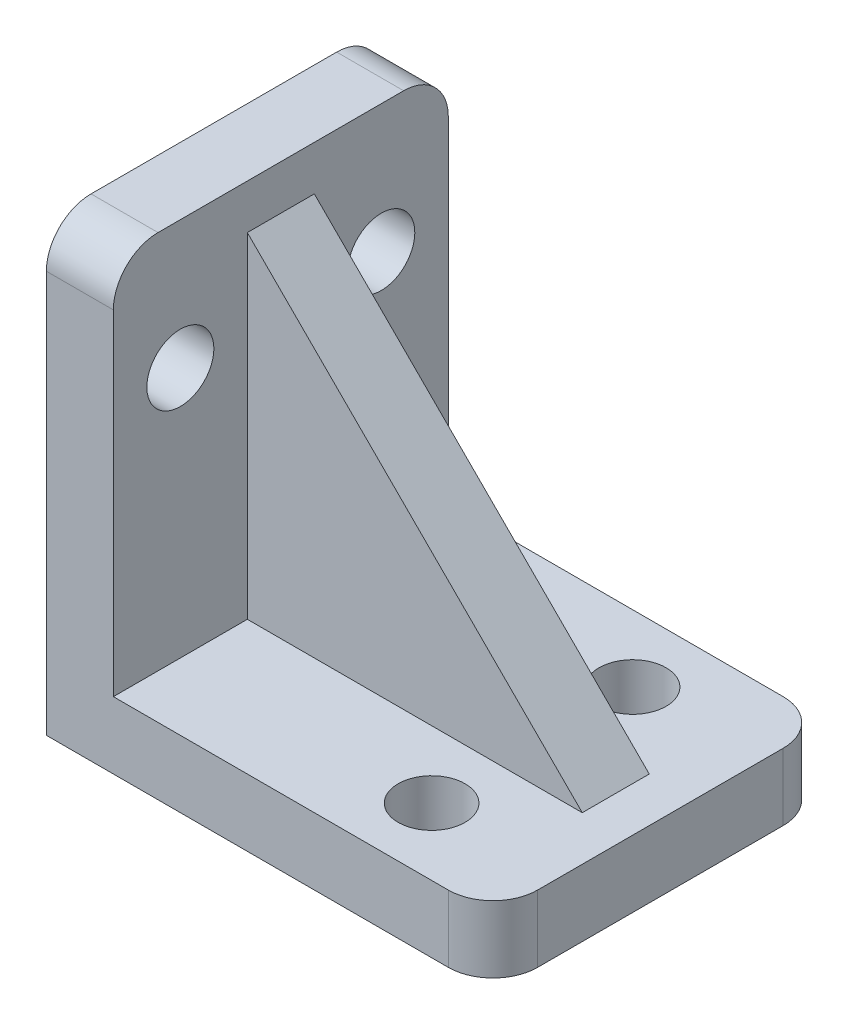
ISO-10303-21;
HEADER;
FILE_DESCRIPTION(('STEP AP214'),'2;1');
FILE_NAME('part.step','',(''),(''),'','','');
FILE_SCHEMA(('AUTOMOTIVE_DESIGN { 1 0 10303 214 1 1 1 1 }'));
ENDSEC;
DATA;
#1=APPLICATION_CONTEXT('core data for automotive mechanical design processes');
#2=APPLICATION_PROTOCOL_DEFINITION('international standard','automotive_design',2000,#1);
#3=PRODUCT_CONTEXT('',#1,'mechanical');
#4=PRODUCT('Part','Part','',(#3));
#5=PRODUCT_RELATED_PRODUCT_CATEGORY('part','',(#4));
#6=PRODUCT_DEFINITION_FORMATION('','',#4);
#7=PRODUCT_DEFINITION_CONTEXT('part definition',#1,'design');
#8=PRODUCT_DEFINITION('design','',#6,#7);
#9=PRODUCT_DEFINITION_SHAPE('','',#8);
#10=(LENGTH_UNIT() NAMED_UNIT(*) SI_UNIT(.MILLI.,.METRE.));
#11=(NAMED_UNIT(*) PLANE_ANGLE_UNIT() SI_UNIT($,.RADIAN.));
#12=(NAMED_UNIT(*) SI_UNIT($,.STERADIAN.) SOLID_ANGLE_UNIT());
#13=UNCERTAINTY_MEASURE_WITH_UNIT(LENGTH_MEASURE(1.E-05),#10,'distance_accuracy_value','');
#14=(GEOMETRIC_REPRESENTATION_CONTEXT(3) GLOBAL_UNCERTAINTY_ASSIGNED_CONTEXT((#13)) GLOBAL_UNIT_ASSIGNED_CONTEXT((#10,
#11,#12)) REPRESENTATION_CONTEXT('',''));
#15=CARTESIAN_POINT('',(0.,0.,0.));
#16=DIRECTION('',(0.,0.,1.));
#17=DIRECTION('',(1.,0.,0.));
#18=AXIS2_PLACEMENT_3D('',#15,#16,#17);
#19=CARTESIAN_POINT('',(-4.63485477178423,10.3236514522822,6.));
#20=DIRECTION('',(-0.707106781186547,-0.707106781186548,0.));
#21=DIRECTION('',(0.707106781186548,-0.707106781186547,0.));
#22=AXIS2_PLACEMENT_3D('',#19,#20,#21);
#23=PLANE('',#22);
#24=DIRECTION('',(0.707106781186548,-0.707106781186547,0.));
#25=VECTOR('',#24,1.);
#26=CARTESIAN_POINT('',(-4.63485477178423,10.3236514522822,9.));
#27=LINE('',#26,#25);
#28=CARTESIAN_POINT('',(-4.63485477178423,10.3236514522822,9.));
#29=VERTEX_POINT('',#28);
#30=CARTESIAN_POINT('',(10.3651452282158,-4.67634854771784,9.));
#31=VERTEX_POINT('',#30);
#32=EDGE_CURVE('E97',#29,#31,#27,.T.);
#33=ORIENTED_EDGE('',*,*,#32,.T.);
#34=DIRECTION('',(0.,0.,1.));
#35=VECTOR('',#34,1.);
#36=CARTESIAN_POINT('',(10.3651452282158,-4.67634854771784,6.));
#37=LINE('',#36,#35);
#38=CARTESIAN_POINT('',(10.3651452282158,-4.67634854771784,6.));
#39=VERTEX_POINT('',#38);
#40=EDGE_CURVE('E12',#39,#31,#37,.T.);
#41=ORIENTED_EDGE('',*,*,#40,.F.);
#42=DIRECTION('',(0.707106781186548,-0.707106781186547,0.));
#43=VECTOR('',#42,1.);
#44=CARTESIAN_POINT('',(-4.63485477178423,10.3236514522822,6.));
#45=LINE('',#44,#43);
#46=CARTESIAN_POINT('',(-4.63485477178423,10.3236514522822,6.));
#47=VERTEX_POINT('',#46);
#48=EDGE_CURVE('E90',#47,#39,#45,.T.);
#49=ORIENTED_EDGE('',*,*,#48,.F.);
#50=DIRECTION('',(0.,0.,1.));
#51=VECTOR('',#50,1.);
#52=CARTESIAN_POINT('',(-4.63485477178423,10.3236514522822,6.));
#53=LINE('',#52,#51);
#54=EDGE_CURVE('E98',#47,#29,#53,.T.);
#55=ORIENTED_EDGE('',*,*,#54,.T.);
#56=EDGE_LOOP('',(#33,#41,#49,#55));
#57=FACE_BOUND('',#56,.T.);
#58=ADVANCED_FACE('F50',(#57),#23,.F.);
#59=CARTESIAN_POINT('',(-4.63485477178423,-4.67634854771784,6.));
#60=DIRECTION('',(0.,1.,0.));
#61=DIRECTION('',(-1.,0.,0.));
#62=AXIS2_PLACEMENT_3D('',#59,#60,#61);
#63=PLANE('',#62);
#64=DIRECTION('',(-1.,0.,0.));
#65=VECTOR('',#64,1.);
#66=CARTESIAN_POINT('',(-4.63485477178423,-4.67634854771784,9.));
#67=LINE('',#66,#65);
#68=CARTESIAN_POINT('',(-4.63485477178423,-4.67634854771784,9.));
#69=VERTEX_POINT('',#68);
#70=EDGE_CURVE('E78',#31,#69,#67,.T.);
#71=ORIENTED_EDGE('',*,*,#70,.T.);
#72=DIRECTION('',(0.,0.,1.));
#73=VECTOR('',#72,1.);
#74=CARTESIAN_POINT('',(-4.63485477178423,-4.67634854771784,6.));
#75=LINE('',#74,#73);
#76=CARTESIAN_POINT('',(-4.63485477178423,-4.67634854771784,6.));
#77=VERTEX_POINT('',#76);
#78=EDGE_CURVE('E58',#77,#69,#75,.T.);
#79=ORIENTED_EDGE('',*,*,#78,.F.);
#80=DIRECTION('',(-1.,0.,0.));
#81=VECTOR('',#80,1.);
#82=CARTESIAN_POINT('',(-4.63485477178423,-4.67634854771784,6.));
#83=LINE('',#82,#81);
#84=EDGE_CURVE('E86',#39,#77,#83,.T.);
#85=ORIENTED_EDGE('',*,*,#84,.F.);
#86=ORIENTED_EDGE('',*,*,#40,.T.);
#87=EDGE_LOOP('',(#71,#79,#85,#86));
#88=FACE_BOUND('',#87,.T.);
#89=ADVANCED_FACE('F87',(#88),#63,.F.);
#90=CARTESIAN_POINT('',(-4.63485477178423,-4.67634854771784,6.));
#91=DIRECTION('',(1.,0.,0.));
#92=DIRECTION('',(0.,1.,0.));
#93=AXIS2_PLACEMENT_3D('',#90,#91,#92);
#94=PLANE('',#93);
#95=DIRECTION('',(0.,1.,0.));
#96=VECTOR('',#95,1.);
#97=CARTESIAN_POINT('',(-4.63485477178423,-4.67634854771784,9.));
#98=LINE('',#97,#96);
#99=EDGE_CURVE('E83',#69,#29,#98,.T.);
#100=ORIENTED_EDGE('',*,*,#99,.T.);
#101=ORIENTED_EDGE('',*,*,#54,.F.);
#102=DIRECTION('',(0.,1.,0.));
#103=VECTOR('',#102,1.);
#104=CARTESIAN_POINT('',(-4.63485477178423,-4.67634854771784,6.));
#105=LINE('',#104,#103);
#106=EDGE_CURVE('E66',#77,#47,#105,.T.);
#107=ORIENTED_EDGE('',*,*,#106,.F.);
#108=ORIENTED_EDGE('',*,*,#78,.T.);
#109=EDGE_LOOP('',(#100,#101,#107,#108));
#110=FACE_BOUND('',#109,.T.);
#111=ADVANCED_FACE('F105',(#110),#94,.F.);
#112=CARTESIAN_POINT('',(0.,0.,6.));
#113=DIRECTION('',(0.,0.,1.));
#114=DIRECTION('',(1.,0.,0.));
#115=AXIS2_PLACEMENT_3D('',#112,#113,#114);
#116=PLANE('',#115);
#117=ORIENTED_EDGE('',*,*,#48,.T.);
#118=ORIENTED_EDGE('',*,*,#84,.T.);
#119=ORIENTED_EDGE('',*,*,#106,.T.);
#120=EDGE_LOOP('',(#117,#118,#119));
#121=FACE_BOUND('',#120,.T.);
#122=ADVANCED_FACE('F93',(#121),#116,.F.);
#123=CARTESIAN_POINT('',(0.,0.,9.));
#124=DIRECTION('',(0.,0.,1.));
#125=DIRECTION('',(1.,0.,0.));
#126=AXIS2_PLACEMENT_3D('',#123,#124,#125);
#127=PLANE('',#126);
#128=ORIENTED_EDGE('',*,*,#32,.F.);
#129=ORIENTED_EDGE('',*,*,#99,.F.);
#130=ORIENTED_EDGE('',*,*,#70,.F.);
#131=EDGE_LOOP('',(#128,#129,#130));
#132=FACE_BOUND('',#131,.T.);
#133=ADVANCED_FACE('F106',(#132),#127,.T.);
#134=CLOSED_SHELL('',(#58,#89,#111,#122,#133));
#135=MANIFOLD_SOLID_BREP('B2',#134);
#136=CARTESIAN_POINT('',(-7.63485477178423,-7.67634854771784,15.));
#137=DIRECTION('',(0.,1.,0.));
#138=DIRECTION('',(0.,0.,1.));
#139=AXIS2_PLACEMENT_3D('',#136,#137,#138);
#140=PLANE('',#139);
#141=DIRECTION('',(1.,0.,0.));
#142=VECTOR('',#141,1.);
#143=CARTESIAN_POINT('',(-7.63485477178423,-7.67634854771784,0.));
#144=LINE('',#143,#142);
#145=CARTESIAN_POINT('',(-7.63485477178423,-7.67634854771784,0.));
#146=VERTEX_POINT('',#145);
#147=CARTESIAN_POINT('',(10.3651452282158,-7.67634854771784,0.));
#148=VERTEX_POINT('',#147);
#149=EDGE_CURVE('E273',#146,#148,#144,.T.);
#150=ORIENTED_EDGE('',*,*,#149,.T.);
#151=CARTESIAN_POINT('',(10.3651452282158,-7.67634854771784,2.));
#152=DIRECTION('',(0.,1.,0.));
#153=DIRECTION('',(0.,0.,1.));
#154=AXIS2_PLACEMENT_3D('',#151,#152,#153);
#155=CIRCLE('',#154,2.);
#156=CARTESIAN_POINT('',(12.3651452282158,-7.67634854771784,2.));
#157=VERTEX_POINT('',#156);
#158=EDGE_CURVE('E319',#148,#157,#155,.F.);
#159=ORIENTED_EDGE('',*,*,#158,.T.);
#160=DIRECTION('',(0.,0.,-1.));
#161=VECTOR('',#160,1.);
#162=CARTESIAN_POINT('',(12.3651452282158,-7.67634854771784,15.));
#163=LINE('',#162,#161);
#164=CARTESIAN_POINT('',(12.3651452282158,-7.67634854771784,13.));
#165=VERTEX_POINT('',#164);
#166=EDGE_CURVE('E254',#165,#157,#163,.T.);
#167=ORIENTED_EDGE('',*,*,#166,.F.);
#168=CARTESIAN_POINT('',(10.3651452282158,-7.67634854771784,13.));
#169=DIRECTION('',(0.,1.,0.));
#170=DIRECTION('',(0.,0.,1.));
#171=AXIS2_PLACEMENT_3D('',#168,#169,#170);
#172=CIRCLE('',#171,2.);
#173=CARTESIAN_POINT('',(10.3651452282158,-7.67634854771784,15.));
#174=VERTEX_POINT('',#173);
#175=EDGE_CURVE('E259',#165,#174,#172,.F.);
#176=ORIENTED_EDGE('',*,*,#175,.T.);
#177=DIRECTION('',(1.,0.,0.));
#178=VECTOR('',#177,1.);
#179=CARTESIAN_POINT('',(-7.63485477178423,-7.67634854771784,15.));
#180=LINE('',#179,#178);
#181=CARTESIAN_POINT('',(-7.63485477178423,-7.67634854771784,15.));
#182=VERTEX_POINT('',#181);
#183=EDGE_CURVE('E234',#182,#174,#180,.T.);
#184=ORIENTED_EDGE('',*,*,#183,.F.);
#185=DIRECTION('',(0.,0.,-1.));
#186=VECTOR('',#185,1.);
#187=CARTESIAN_POINT('',(-7.63485477178423,-7.67634854771784,15.));
#188=LINE('',#187,#186);
#189=EDGE_CURVE('E244',#182,#146,#188,.T.);
#190=ORIENTED_EDGE('',*,*,#189,.T.);
#191=EDGE_LOOP('',(#150,#159,#167,#176,#184,#190));
#192=FACE_BOUND('',#191,.T.);
#193=CARTESIAN_POINT('',(6.61809640509843,-7.67634854771784,12.));
#194=DIRECTION('',(0.,1.,0.));
#195=DIRECTION('',(0.,0.,1.));
#196=AXIS2_PLACEMENT_3D('',#193,#194,#195);
#197=CIRCLE('',#196,1.5);
#198=CARTESIAN_POINT('',(6.61809640509843,-7.67634854771784,13.5));
#199=VERTEX_POINT('',#198);
#200=EDGE_CURVE('E525',#199,#199,#197,.F.);
#201=ORIENTED_EDGE('',*,*,#200,.F.);
#202=EDGE_LOOP('',(#201));
#203=FACE_BOUND('',#202,.T.);
#204=CARTESIAN_POINT('',(6.61809640509846,-7.67634854771784,3.00000000000004));
#205=DIRECTION('',(0.,1.,0.));
#206=DIRECTION('',(0.,0.,1.));
#207=AXIS2_PLACEMENT_3D('',#204,#205,#206);
#208=CIRCLE('',#207,1.5);
#209=CARTESIAN_POINT('',(6.61809640509846,-7.67634854771784,4.50000000000004));
#210=VERTEX_POINT('',#209);
#211=EDGE_CURVE('E520',#210,#210,#208,.T.);
#212=ORIENTED_EDGE('',*,*,#211,.T.);
#213=EDGE_LOOP('',(#212));
#214=FACE_BOUND('',#213,.T.);
#215=ADVANCED_FACE('F150',(#192,#203,#214),#140,.F.);
#216=CARTESIAN_POINT('',(12.3651452282158,-4.67634854771784,15.));
#217=DIRECTION('',(0.,-1.,0.));
#218=DIRECTION('',(1.,0.,0.));
#219=AXIS2_PLACEMENT_3D('',#216,#217,#218);
#220=PLANE('',#219);
#221=DIRECTION('',(0.,0.,-1.));
#222=VECTOR('',#221,1.);
#223=CARTESIAN_POINT('',(12.3651452282158,-4.67634854771784,15.));
#224=LINE('',#223,#222);
#225=CARTESIAN_POINT('',(12.3651452282158,-4.67634854771784,13.));
#226=VERTEX_POINT('',#225);
#227=CARTESIAN_POINT('',(12.3651452282158,-4.67634854771784,2.));
#228=VERTEX_POINT('',#227);
#229=EDGE_CURVE('E288',#226,#228,#224,.T.);
#230=ORIENTED_EDGE('',*,*,#229,.T.);
#231=CARTESIAN_POINT('',(10.3651452282158,-4.67634854771784,2.));
#232=DIRECTION('',(0.,-1.,0.));
#233=DIRECTION('',(1.,0.,0.));
#234=AXIS2_PLACEMENT_3D('',#231,#232,#233);
#235=CIRCLE('',#234,2.);
#236=CARTESIAN_POINT('',(10.3651452282158,-4.67634854771784,0.));
#237=VERTEX_POINT('',#236);
#238=EDGE_CURVE('E308',#228,#237,#235,.F.);
#239=ORIENTED_EDGE('',*,*,#238,.T.);
#240=DIRECTION('',(-1.,0.,0.));
#241=VECTOR('',#240,1.);
#242=CARTESIAN_POINT('',(12.3651452282158,-4.67634854771784,0.));
#243=LINE('',#242,#241);
#244=CARTESIAN_POINT('',(-4.63485477178423,-4.67634854771784,0.));
#245=VERTEX_POINT('',#244);
#246=EDGE_CURVE('E277',#237,#245,#243,.T.);
#247=ORIENTED_EDGE('',*,*,#246,.T.);
#248=DIRECTION('',(0.,0.,-1.));
#249=VECTOR('',#248,1.);
#250=CARTESIAN_POINT('',(-4.63485477178423,-4.67634854771784,15.));
#251=LINE('',#250,#249);
#252=CARTESIAN_POINT('',(-4.63485477178423,-4.67634854771784,15.));
#253=VERTEX_POINT('',#252);
#254=EDGE_CURVE('E284',#253,#245,#251,.T.);
#255=ORIENTED_EDGE('',*,*,#254,.F.);
#256=DIRECTION('',(-1.,0.,0.));
#257=VECTOR('',#256,1.);
#258=CARTESIAN_POINT('',(12.3651452282158,-4.67634854771784,15.));
#259=LINE('',#258,#257);
#260=CARTESIAN_POINT('',(10.3651452282158,-4.67634854771784,15.));
#261=VERTEX_POINT('',#260);
#262=EDGE_CURVE('E261',#261,#253,#259,.T.);
#263=ORIENTED_EDGE('',*,*,#262,.F.);
#264=CARTESIAN_POINT('',(10.3651452282158,-4.67634854771784,13.));
#265=DIRECTION('',(0.,-1.,0.));
#266=DIRECTION('',(1.,0.,0.));
#267=AXIS2_PLACEMENT_3D('',#264,#265,#266);
#268=CIRCLE('',#267,2.);
#269=EDGE_CURVE('E305',#261,#226,#268,.F.);
#270=ORIENTED_EDGE('',*,*,#269,.T.);
#271=EDGE_LOOP('',(#230,#239,#247,#255,#263,#270));
#272=FACE_BOUND('',#271,.T.);
#273=CARTESIAN_POINT('',(6.61809640509843,-4.67634854771784,12.));
#274=DIRECTION('',(0.,1.,0.));
#275=DIRECTION('',(-1.,0.,0.));
#276=AXIS2_PLACEMENT_3D('',#273,#274,#275);
#277=CIRCLE('',#276,1.5);
#278=CARTESIAN_POINT('',(5.11809640509843,-4.67634854771784,12.));
#279=VERTEX_POINT('',#278);
#280=EDGE_CURVE('E530',#279,#279,#277,.F.);
#281=ORIENTED_EDGE('',*,*,#280,.T.);
#282=EDGE_LOOP('',(#281));
#283=FACE_BOUND('',#282,.T.);
#284=CARTESIAN_POINT('',(6.61809640509846,-4.67634854771784,3.00000000000004));
#285=DIRECTION('',(0.,1.,0.));
#286=DIRECTION('',(-1.,0.,0.));
#287=AXIS2_PLACEMENT_3D('',#284,#285,#286);
#288=CIRCLE('',#287,1.5);
#289=CARTESIAN_POINT('',(5.11809640509846,-4.67634854771784,3.00000000000004));
#290=VERTEX_POINT('',#289);
#291=EDGE_CURVE('E529',#290,#290,#288,.T.);
#292=ORIENTED_EDGE('',*,*,#291,.F.);
#293=EDGE_LOOP('',(#292));
#294=FACE_BOUND('',#293,.T.);
#295=ADVANCED_FACE('F351',(#272,#283,#294),#220,.F.);
#296=CARTESIAN_POINT('',(-7.63485477178423,12.3236514522822,15.));
#297=DIRECTION('',(1.,0.,0.));
#298=DIRECTION('',(0.,0.,-1.));
#299=AXIS2_PLACEMENT_3D('',#296,#297,#298);
#300=PLANE('',#299);
#301=DIRECTION('',(0.,-1.,0.));
#302=VECTOR('',#301,1.);
#303=CARTESIAN_POINT('',(-7.63485477178423,12.3236514522822,15.));
#304=LINE('',#303,#302);
#305=CARTESIAN_POINT('',(-7.63485477178423,10.3236514522822,15.));
#306=VERTEX_POINT('',#305);
#307=EDGE_CURVE('E229',#306,#182,#304,.T.);
#308=ORIENTED_EDGE('',*,*,#307,.F.);
#309=CARTESIAN_POINT('',(-7.63485477178423,10.3236514522822,13.));
#310=DIRECTION('',(1.,0.,0.));
#311=DIRECTION('',(0.,0.,-1.));
#312=AXIS2_PLACEMENT_3D('',#309,#310,#311);
#313=CIRCLE('',#312,2.);
#314=CARTESIAN_POINT('',(-7.63485477178423,12.3236514522822,13.));
#315=VERTEX_POINT('',#314);
#316=EDGE_CURVE('E330',#306,#315,#313,.F.);
#317=ORIENTED_EDGE('',*,*,#316,.T.);
#318=DIRECTION('',(0.,0.,-1.));
#319=VECTOR('',#318,1.);
#320=CARTESIAN_POINT('',(-7.63485477178423,12.3236514522822,15.));
#321=LINE('',#320,#319);
#322=CARTESIAN_POINT('',(-7.63485477178423,12.3236514522822,2.));
#323=VERTEX_POINT('',#322);
#324=EDGE_CURVE('E253',#315,#323,#321,.T.);
#325=ORIENTED_EDGE('',*,*,#324,.T.);
#326=CARTESIAN_POINT('',(-7.63485477178423,10.3236514522822,2.));
#327=DIRECTION('',(1.,0.,0.));
#328=DIRECTION('',(0.,0.,-1.));
#329=AXIS2_PLACEMENT_3D('',#326,#327,#328);
#330=CIRCLE('',#329,2.);
#331=CARTESIAN_POINT('',(-7.63485477178423,10.3236514522822,0.));
#332=VERTEX_POINT('',#331);
#333=EDGE_CURVE('E327',#323,#332,#330,.F.);
#334=ORIENTED_EDGE('',*,*,#333,.T.);
#335=DIRECTION('',(0.,-1.,0.));
#336=VECTOR('',#335,1.);
#337=CARTESIAN_POINT('',(-7.63485477178423,12.3236514522822,0.));
#338=LINE('',#337,#336);
#339=EDGE_CURVE('E248',#332,#146,#338,.T.);
#340=ORIENTED_EDGE('',*,*,#339,.T.);
#341=ORIENTED_EDGE('',*,*,#189,.F.);
#342=EDGE_LOOP('',(#308,#317,#325,#334,#340,#341));
#343=FACE_BOUND('',#342,.T.);
#344=CARTESIAN_POINT('',(-7.63485477178423,6.57660262916484,3.));
#345=DIRECTION('',(1.,0.,0.));
#346=DIRECTION('',(0.,0.,-1.));
#347=AXIS2_PLACEMENT_3D('',#344,#345,#346);
#348=CIRCLE('',#347,1.5);
#349=CARTESIAN_POINT('',(-7.63485477178423,6.57660262916484,1.5));
#350=VERTEX_POINT('',#349);
#351=EDGE_CURVE('E509',#350,#350,#348,.F.);
#352=ORIENTED_EDGE('',*,*,#351,.F.);
#353=EDGE_LOOP('',(#352));
#354=FACE_BOUND('',#353,.T.);
#355=CARTESIAN_POINT('',(-7.63485477178423,6.57660262916484,12.));
#356=DIRECTION('',(1.,0.,0.));
#357=DIRECTION('',(0.,0.,-1.));
#358=AXIS2_PLACEMENT_3D('',#355,#356,#357);
#359=CIRCLE('',#358,1.5);
#360=CARTESIAN_POINT('',(-7.63485477178423,6.57660262916484,10.5));
#361=VERTEX_POINT('',#360);
#362=EDGE_CURVE('E274',#361,#361,#359,.T.);
#363=ORIENTED_EDGE('',*,*,#362,.T.);
#364=EDGE_LOOP('',(#363));
#365=FACE_BOUND('',#364,.T.);
#366=ADVANCED_FACE('F245',(#343,#354,#365),#300,.F.);
#367=CARTESIAN_POINT('',(-4.63485477178423,-4.67634854771784,15.));
#368=DIRECTION('',(-1.,0.,0.));
#369=DIRECTION('',(0.,-1.,0.));
#370=AXIS2_PLACEMENT_3D('',#367,#368,#369);
#371=PLANE('',#370);
#372=DIRECTION('',(0.,0.,-1.));
#373=VECTOR('',#372,1.);
#374=CARTESIAN_POINT('',(-4.63485477178423,12.3236514522822,15.));
#375=LINE('',#374,#373);
#376=CARTESIAN_POINT('',(-4.63485477178423,12.3236514522822,13.));
#377=VERTEX_POINT('',#376);
#378=CARTESIAN_POINT('',(-4.63485477178423,12.3236514522822,2.));
#379=VERTEX_POINT('',#378);
#380=EDGE_CURVE('E270',#377,#379,#375,.T.);
#381=ORIENTED_EDGE('',*,*,#380,.F.);
#382=CARTESIAN_POINT('',(-4.63485477178423,10.3236514522822,13.));
#383=DIRECTION('',(-1.,0.,0.));
#384=DIRECTION('',(0.,-1.,0.));
#385=AXIS2_PLACEMENT_3D('',#382,#383,#384);
#386=CIRCLE('',#385,2.);
#387=CARTESIAN_POINT('',(-4.63485477178423,10.3236514522822,15.));
#388=VERTEX_POINT('',#387);
#389=EDGE_CURVE('E48',#377,#388,#386,.F.);
#390=ORIENTED_EDGE('',*,*,#389,.T.);
#391=DIRECTION('',(0.,1.,0.));
#392=VECTOR('',#391,1.);
#393=CARTESIAN_POINT('',(-4.63485477178423,-4.67634854771784,15.));
#394=LINE('',#393,#392);
#395=EDGE_CURVE('E264',#253,#388,#394,.T.);
#396=ORIENTED_EDGE('',*,*,#395,.F.);
#397=ORIENTED_EDGE('',*,*,#254,.T.);
#398=DIRECTION('',(0.,1.,0.));
#399=VECTOR('',#398,1.);
#400=CARTESIAN_POINT('',(-4.63485477178423,-4.67634854771784,0.));
#401=LINE('',#400,#399);
#402=CARTESIAN_POINT('',(-4.63485477178423,10.3236514522822,0.));
#403=VERTEX_POINT('',#402);
#404=EDGE_CURVE('E241',#245,#403,#401,.T.);
#405=ORIENTED_EDGE('',*,*,#404,.T.);
#406=CARTESIAN_POINT('',(-4.63485477178423,10.3236514522822,2.));
#407=DIRECTION('',(-1.,0.,0.));
#408=DIRECTION('',(0.,-1.,0.));
#409=AXIS2_PLACEMENT_3D('',#406,#407,#408);
#410=CIRCLE('',#409,2.);
#411=EDGE_CURVE('E159',#403,#379,#410,.F.);
#412=ORIENTED_EDGE('',*,*,#411,.T.);
#413=EDGE_LOOP('',(#381,#390,#396,#397,#405,#412));
#414=FACE_BOUND('',#413,.T.);
#415=CARTESIAN_POINT('',(-4.63485477178423,6.57660262916484,3.));
#416=DIRECTION('',(1.,0.,0.));
#417=DIRECTION('',(0.,1.,0.));
#418=AXIS2_PLACEMENT_3D('',#415,#416,#417);
#419=CIRCLE('',#418,1.5);
#420=CARTESIAN_POINT('',(-4.63485477178423,8.07660262916484,3.));
#421=VERTEX_POINT('',#420);
#422=EDGE_CURVE('E506',#421,#421,#419,.F.);
#423=ORIENTED_EDGE('',*,*,#422,.T.);
#424=EDGE_LOOP('',(#423));
#425=FACE_BOUND('',#424,.T.);
#426=CARTESIAN_POINT('',(-4.63485477178423,6.57660262916484,12.));
#427=DIRECTION('',(1.,0.,0.));
#428=DIRECTION('',(0.,1.,0.));
#429=AXIS2_PLACEMENT_3D('',#426,#427,#428);
#430=CIRCLE('',#429,1.5);
#431=CARTESIAN_POINT('',(-4.63485477178423,8.07660262916484,12.));
#432=VERTEX_POINT('',#431);
#433=EDGE_CURVE('E511',#432,#432,#430,.T.);
#434=ORIENTED_EDGE('',*,*,#433,.F.);
#435=EDGE_LOOP('',(#434));
#436=FACE_BOUND('',#435,.T.);
#437=ADVANCED_FACE('F346',(#414,#425,#436),#371,.F.);
#438=CARTESIAN_POINT('',(-4.63485477178423,12.3236514522822,15.));
#439=DIRECTION('',(0.,-1.,0.));
#440=DIRECTION('',(1.,0.,0.));
#441=AXIS2_PLACEMENT_3D('',#438,#439,#440);
#442=PLANE('',#441);
#443=ORIENTED_EDGE('',*,*,#324,.F.);
#444=DIRECTION('',(-1.,0.,0.));
#445=VECTOR('',#444,1.);
#446=CARTESIAN_POINT('',(-4.63485477178423,12.3236514522822,13.));
#447=LINE('',#446,#445);
#448=EDGE_CURVE('E172',#315,#377,#447,.F.);
#449=ORIENTED_EDGE('',*,*,#448,.T.);
#450=ORIENTED_EDGE('',*,*,#380,.T.);
#451=DIRECTION('',(-1.,0.,0.));
#452=VECTOR('',#451,1.);
#453=CARTESIAN_POINT('',(-4.63485477178423,12.3236514522822,2.));
#454=LINE('',#453,#452);
#455=EDGE_CURVE('E333',#379,#323,#454,.T.);
#456=ORIENTED_EDGE('',*,*,#455,.T.);
#457=EDGE_LOOP('',(#443,#449,#450,#456));
#458=FACE_BOUND('',#457,.T.);
#459=ADVANCED_FACE('F340',(#458),#442,.F.);
#460=CARTESIAN_POINT('',(12.3651452282158,-7.67634854771784,15.));
#461=DIRECTION('',(-1.,0.,0.));
#462=DIRECTION('',(0.,0.,1.));
#463=AXIS2_PLACEMENT_3D('',#460,#461,#462);
#464=PLANE('',#463);
#465=ORIENTED_EDGE('',*,*,#166,.T.);
#466=DIRECTION('',(0.,1.,0.));
#467=VECTOR('',#466,1.);
#468=CARTESIAN_POINT('',(12.3651452282158,-7.67634854771784,2.));
#469=LINE('',#468,#467);
#470=EDGE_CURVE('E301',#157,#228,#469,.T.);
#471=ORIENTED_EDGE('',*,*,#470,.T.);
#472=ORIENTED_EDGE('',*,*,#229,.F.);
#473=DIRECTION('',(0.,1.,0.));
#474=VECTOR('',#473,1.);
#475=CARTESIAN_POINT('',(12.3651452282158,-7.67634854771784,13.));
#476=LINE('',#475,#474);
#477=EDGE_CURVE('E298',#226,#165,#476,.F.);
#478=ORIENTED_EDGE('',*,*,#477,.T.);
#479=EDGE_LOOP('',(#465,#471,#472,#478));
#480=FACE_BOUND('',#479,.T.);
#481=ADVANCED_FACE('F372',(#480),#464,.F.);
#482=CARTESIAN_POINT('',(0.,0.,15.));
#483=DIRECTION('',(0.,0.,1.));
#484=DIRECTION('',(1.,0.,0.));
#485=AXIS2_PLACEMENT_3D('',#482,#483,#484);
#486=PLANE('',#485);
#487=ORIENTED_EDGE('',*,*,#183,.T.);
#488=DIRECTION('',(0.,1.,0.));
#489=VECTOR('',#488,1.);
#490=CARTESIAN_POINT('',(10.3651452282158,-4.67634854771784,15.));
#491=LINE('',#490,#489);
#492=EDGE_CURVE('E324',#174,#261,#491,.T.);
#493=ORIENTED_EDGE('',*,*,#492,.T.);
#494=ORIENTED_EDGE('',*,*,#262,.T.);
#495=ORIENTED_EDGE('',*,*,#395,.T.);
#496=DIRECTION('',(-1.,0.,0.));
#497=VECTOR('',#496,1.);
#498=CARTESIAN_POINT('',(-7.63485477178423,10.3236514522822,15.));
#499=LINE('',#498,#497);
#500=EDGE_CURVE('E238',#388,#306,#499,.T.);
#501=ORIENTED_EDGE('',*,*,#500,.T.);
#502=ORIENTED_EDGE('',*,*,#307,.T.);
#503=EDGE_LOOP('',(#487,#493,#494,#495,#501,#502));
#504=FACE_BOUND('',#503,.T.);
#505=ADVANCED_FACE('F231',(#504),#486,.T.);
#506=CARTESIAN_POINT('',(0.,0.,0.));
#507=DIRECTION('',(0.,0.,1.));
#508=DIRECTION('',(1.,0.,0.));
#509=AXIS2_PLACEMENT_3D('',#506,#507,#508);
#510=PLANE('',#509);
#511=ORIENTED_EDGE('',*,*,#246,.F.);
#512=DIRECTION('',(0.,1.,0.));
#513=VECTOR('',#512,1.);
#514=CARTESIAN_POINT('',(10.3651452282158,0.,0.));
#515=LINE('',#514,#513);
#516=EDGE_CURVE('E314',#237,#148,#515,.F.);
#517=ORIENTED_EDGE('',*,*,#516,.T.);
#518=ORIENTED_EDGE('',*,*,#149,.F.);
#519=ORIENTED_EDGE('',*,*,#339,.F.);
#520=DIRECTION('',(-1.,0.,0.));
#521=VECTOR('',#520,1.);
#522=CARTESIAN_POINT('',(0.,10.3236514522822,0.));
#523=LINE('',#522,#521);
#524=EDGE_CURVE('E311',#332,#403,#523,.F.);
#525=ORIENTED_EDGE('',*,*,#524,.T.);
#526=ORIENTED_EDGE('',*,*,#404,.F.);
#527=EDGE_LOOP('',(#511,#517,#518,#519,#525,#526));
#528=FACE_BOUND('',#527,.T.);
#529=ADVANCED_FACE('F356',(#528),#510,.F.);
#530=CARTESIAN_POINT('',(-19.6348547717842,6.57660262916483,3.));
#531=DIRECTION('',(1.,0.,0.));
#532=DIRECTION('',(0.,1.,0.));
#533=AXIS2_PLACEMENT_3D('',#530,#531,#532);
#534=CYLINDRICAL_SURFACE('',#533,1.5);
#535=ORIENTED_EDGE('',*,*,#422,.F.);
#536=EDGE_LOOP('',(#535));
#537=FACE_BOUND('',#536,.T.);
#538=ORIENTED_EDGE('',*,*,#351,.T.);
#539=EDGE_LOOP('',(#538));
#540=FACE_BOUND('',#539,.T.);
#541=ADVANCED_FACE('F399',(#537,#540),#534,.F.);
#542=CARTESIAN_POINT('',(-19.6348547717842,6.57660262916483,12.));
#543=DIRECTION('',(1.,0.,0.));
#544=DIRECTION('',(0.,1.,0.));
#545=AXIS2_PLACEMENT_3D('',#542,#543,#544);
#546=CYLINDRICAL_SURFACE('',#545,1.5);
#547=ORIENTED_EDGE('',*,*,#433,.T.);
#548=EDGE_LOOP('',(#547));
#549=FACE_BOUND('',#548,.T.);
#550=ORIENTED_EDGE('',*,*,#362,.F.);
#551=EDGE_LOOP('',(#550));
#552=FACE_BOUND('',#551,.T.);
#553=ADVANCED_FACE('F464',(#549,#552),#546,.F.);
#554=CARTESIAN_POINT('',(6.61809640509843,-19.6763485477178,12.));
#555=DIRECTION('',(0.,1.,0.));
#556=DIRECTION('',(-1.,0.,0.));
#557=AXIS2_PLACEMENT_3D('',#554,#555,#556);
#558=CYLINDRICAL_SURFACE('',#557,1.5);
#559=ORIENTED_EDGE('',*,*,#280,.F.);
#560=EDGE_LOOP('',(#559));
#561=FACE_BOUND('',#560,.T.);
#562=ORIENTED_EDGE('',*,*,#200,.T.);
#563=EDGE_LOOP('',(#562));
#564=FACE_BOUND('',#563,.T.);
#565=ADVANCED_FACE('F457',(#561,#564),#558,.F.);
#566=CARTESIAN_POINT('',(6.61809640509846,-19.6763485477178,3.00000000000004));
#567=DIRECTION('',(0.,1.,0.));
#568=DIRECTION('',(-1.,0.,0.));
#569=AXIS2_PLACEMENT_3D('',#566,#567,#568);
#570=CYLINDRICAL_SURFACE('',#569,1.5);
#571=ORIENTED_EDGE('',*,*,#291,.T.);
#572=EDGE_LOOP('',(#571));
#573=FACE_BOUND('',#572,.T.);
#574=ORIENTED_EDGE('',*,*,#211,.F.);
#575=EDGE_LOOP('',(#574));
#576=FACE_BOUND('',#575,.T.);
#577=ADVANCED_FACE('F380',(#573,#576),#570,.F.);
#578=CARTESIAN_POINT('',(10.3651452282158,-7.67634854771784,2.));
#579=DIRECTION('',(0.,1.,0.));
#580=DIRECTION('',(0.,0.,1.));
#581=AXIS2_PLACEMENT_3D('',#578,#579,#580);
#582=CYLINDRICAL_SURFACE('',#581,2.);
#583=ORIENTED_EDGE('',*,*,#158,.F.);
#584=ORIENTED_EDGE('',*,*,#516,.F.);
#585=ORIENTED_EDGE('',*,*,#238,.F.);
#586=ORIENTED_EDGE('',*,*,#470,.F.);
#587=EDGE_LOOP('',(#583,#584,#585,#586));
#588=FACE_BOUND('',#587,.T.);
#589=ADVANCED_FACE('F377',(#588),#582,.T.);
#590=CARTESIAN_POINT('',(10.3651452282158,0.,13.));
#591=DIRECTION('',(0.,-1.,0.));
#592=DIRECTION('',(0.,0.,-1.));
#593=AXIS2_PLACEMENT_3D('',#590,#591,#592);
#594=CYLINDRICAL_SURFACE('',#593,2.);
#595=ORIENTED_EDGE('',*,*,#175,.F.);
#596=ORIENTED_EDGE('',*,*,#477,.F.);
#597=ORIENTED_EDGE('',*,*,#269,.F.);
#598=ORIENTED_EDGE('',*,*,#492,.F.);
#599=EDGE_LOOP('',(#595,#596,#597,#598));
#600=FACE_BOUND('',#599,.T.);
#601=ADVANCED_FACE('F363',(#600),#594,.T.);
#602=CARTESIAN_POINT('',(0.,10.3236514522822,13.));
#603=DIRECTION('',(1.,0.,0.));
#604=DIRECTION('',(0.,1.,0.));
#605=AXIS2_PLACEMENT_3D('',#602,#603,#604);
#606=CYLINDRICAL_SURFACE('',#605,2.);
#607=ORIENTED_EDGE('',*,*,#389,.F.);
#608=ORIENTED_EDGE('',*,*,#448,.F.);
#609=ORIENTED_EDGE('',*,*,#316,.F.);
#610=ORIENTED_EDGE('',*,*,#500,.F.);
#611=EDGE_LOOP('',(#607,#608,#609,#610));
#612=FACE_BOUND('',#611,.T.);
#613=ADVANCED_FACE('F344',(#612),#606,.T.);
#614=CARTESIAN_POINT('',(-4.63485477178423,10.3236514522822,2.));
#615=DIRECTION('',(-1.,0.,0.));
#616=DIRECTION('',(0.,-1.,0.));
#617=AXIS2_PLACEMENT_3D('',#614,#615,#616);
#618=CYLINDRICAL_SURFACE('',#617,2.);
#619=ORIENTED_EDGE('',*,*,#411,.F.);
#620=ORIENTED_EDGE('',*,*,#524,.F.);
#621=ORIENTED_EDGE('',*,*,#333,.F.);
#622=ORIENTED_EDGE('',*,*,#455,.F.);
#623=EDGE_LOOP('',(#619,#620,#621,#622));
#624=FACE_BOUND('',#623,.T.);
#625=ADVANCED_FACE('F152',(#624),#618,.T.);
#626=CLOSED_SHELL('',(#215,#295,#366,#437,#459,#481,#505,#529,#541,#553,#565,#577,#589,#601,
#613,#625));
#627=MANIFOLD_SOLID_BREP('B6',#626);
#628=ADVANCED_BREP_SHAPE_REPRESENTATION('',(#18,#135,#627),#14);
#629=SHAPE_DEFINITION_REPRESENTATION(#9,#628);
ENDSEC;
END-ISO-10303-21;
